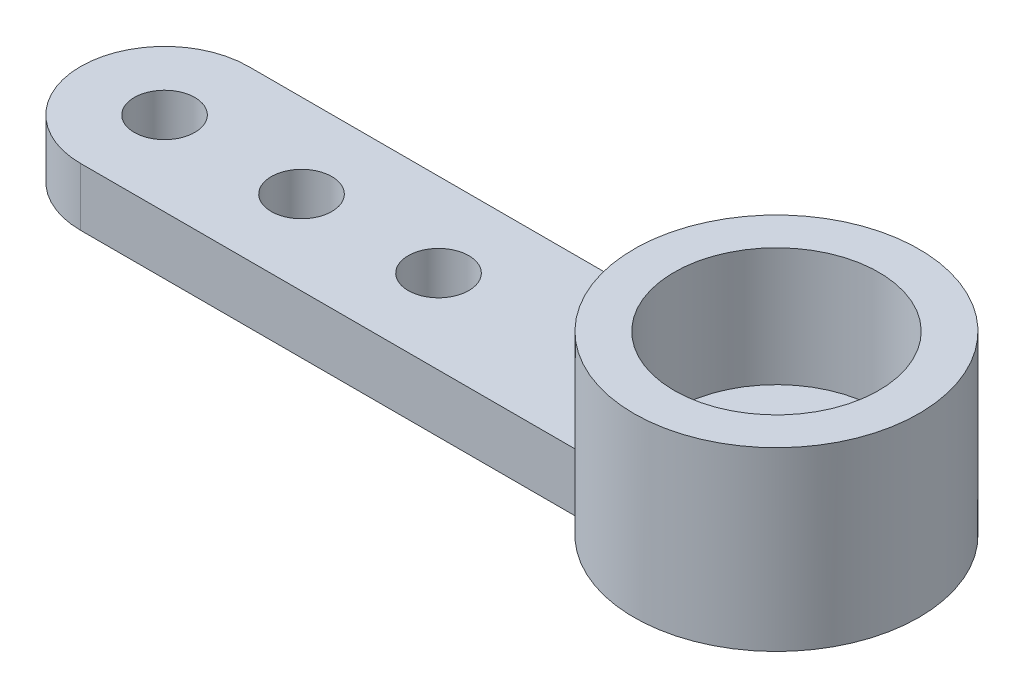
ISO-10303-21;
HEADER;
FILE_DESCRIPTION(('STEP AP214'),'2;1');
FILE_NAME('part.step','',(''),(''),'','','');
FILE_SCHEMA(('AUTOMOTIVE_DESIGN { 1 0 10303 214 1 1 1 1 }'));
ENDSEC;
DATA;
#1=APPLICATION_CONTEXT('core data for automotive mechanical design processes');
#2=APPLICATION_PROTOCOL_DEFINITION('international standard','automotive_design',2000,#1);
#3=PRODUCT_CONTEXT('',#1,'mechanical');
#4=PRODUCT('Part','Part','',(#3));
#5=PRODUCT_RELATED_PRODUCT_CATEGORY('part','',(#4));
#6=PRODUCT_DEFINITION_FORMATION('','',#4);
#7=PRODUCT_DEFINITION_CONTEXT('part definition',#1,'design');
#8=PRODUCT_DEFINITION('design','',#6,#7);
#9=PRODUCT_DEFINITION_SHAPE('','',#8);
#10=(LENGTH_UNIT() NAMED_UNIT(*) SI_UNIT(.MILLI.,.METRE.));
#11=(NAMED_UNIT(*) PLANE_ANGLE_UNIT() SI_UNIT($,.RADIAN.));
#12=(NAMED_UNIT(*) SI_UNIT($,.STERADIAN.) SOLID_ANGLE_UNIT());
#13=UNCERTAINTY_MEASURE_WITH_UNIT(LENGTH_MEASURE(1.E-05),#10,'distance_accuracy_value','');
#14=(GEOMETRIC_REPRESENTATION_CONTEXT(3) GLOBAL_UNCERTAINTY_ASSIGNED_CONTEXT((#13)) GLOBAL_UNIT_ASSIGNED_CONTEXT((#10,
#11,#12)) REPRESENTATION_CONTEXT('',''));
#15=CARTESIAN_POINT('',(0.,0.,0.));
#16=DIRECTION('',(0.,0.,1.));
#17=DIRECTION('',(1.,0.,0.));
#18=AXIS2_PLACEMENT_3D('',#15,#16,#17);
#19=CARTESIAN_POINT('',(0.,1.1,1.59385));
#20=DIRECTION('',(0.,0.,-1.));
#21=DIRECTION('',(-1.,0.,0.));
#22=AXIS2_PLACEMENT_3D('',#19,#20,#21);
#23=PLANE('',#22);
#24=DIRECTION('',(1.,0.,0.));
#25=VECTOR('',#24,1.);
#26=CARTESIAN_POINT('',(0.,0.,1.59385));
#27=LINE('',#26,#25);
#28=CARTESIAN_POINT('',(-11.61415,0.,1.59385));
#29=VERTEX_POINT('',#28);
#30=CARTESIAN_POINT('',(-2.18568254499596,0.,1.59385));
#31=VERTEX_POINT('',#30);
#32=EDGE_CURVE('E98',#29,#31,#27,.T.);
#33=ORIENTED_EDGE('',*,*,#32,.T.);
#34=DIRECTION('',(0.,-1.,0.));
#35=VECTOR('',#34,1.);
#36=CARTESIAN_POINT('',(-2.18568254499596,1.1,1.59385));
#37=LINE('',#36,#35);
#38=CARTESIAN_POINT('',(-2.18568254499596,1.1,1.59385));
#39=VERTEX_POINT('',#38);
#40=EDGE_CURVE('E11',#39,#31,#37,.T.);
#41=ORIENTED_EDGE('',*,*,#40,.F.);
#42=DIRECTION('',(1.,0.,0.));
#43=VECTOR('',#42,1.);
#44=CARTESIAN_POINT('',(0.,1.1,1.59385));
#45=LINE('',#44,#43);
#46=CARTESIAN_POINT('',(-11.61415,1.1,1.59385));
#47=VERTEX_POINT('',#46);
#48=EDGE_CURVE('E74',#47,#39,#45,.T.);
#49=ORIENTED_EDGE('',*,*,#48,.F.);
#50=DIRECTION('',(0.,-1.,0.));
#51=VECTOR('',#50,1.);
#52=CARTESIAN_POINT('',(-11.61415,1.1,1.59385));
#53=LINE('',#52,#51);
#54=EDGE_CURVE('E121',#47,#29,#53,.T.);
#55=ORIENTED_EDGE('',*,*,#54,.T.);
#56=EDGE_LOOP('',(#33,#41,#49,#55));
#57=FACE_BOUND('',#56,.T.);
#58=ADVANCED_FACE('F34',(#57),#23,.F.);
#59=CARTESIAN_POINT('',(0.,1.1,0.));
#60=DIRECTION('',(0.,-1.,0.));
#61=DIRECTION('',(0.,0.,-1.));
#62=AXIS2_PLACEMENT_3D('',#59,#60,#61);
#63=CYLINDRICAL_SURFACE('',#62,2.7051);
#64=CARTESIAN_POINT('',(0.,0.,0.));
#65=DIRECTION('',(0.,1.,0.));
#66=DIRECTION('',(0.,0.,1.));
#67=AXIS2_PLACEMENT_3D('',#64,#65,#66);
#68=CIRCLE('',#67,2.7051);
#69=CARTESIAN_POINT('',(-2.18568254499596,0.,-1.59385));
#70=VERTEX_POINT('',#69);
#71=EDGE_CURVE('E90',#31,#70,#68,.T.);
#72=ORIENTED_EDGE('',*,*,#71,.T.);
#73=DIRECTION('',(0.,-1.,0.));
#74=VECTOR('',#73,1.);
#75=CARTESIAN_POINT('',(-2.18568254499596,1.1,-1.59385));
#76=LINE('',#75,#74);
#77=CARTESIAN_POINT('',(-2.18568254499596,1.1,-1.59385));
#78=VERTEX_POINT('',#77);
#79=EDGE_CURVE('E43',#78,#70,#76,.T.);
#80=ORIENTED_EDGE('',*,*,#79,.F.);
#81=CARTESIAN_POINT('',(0.,1.1,0.));
#82=DIRECTION('',(0.,1.,0.));
#83=DIRECTION('',(0.,0.,1.));
#84=AXIS2_PLACEMENT_3D('',#81,#82,#83);
#85=CIRCLE('',#84,2.7051);
#86=EDGE_CURVE('E89',#78,#39,#85,.T.);
#87=ORIENTED_EDGE('',*,*,#86,.T.);
#88=ORIENTED_EDGE('',*,*,#40,.T.);
#89=EDGE_LOOP('',(#72,#80,#87,#88));
#90=FACE_BOUND('',#89,.T.);
#91=CARTESIAN_POINT('',(0.,3.35,0.));
#92=DIRECTION('',(0.,1.,0.));
#93=DIRECTION('',(0.,0.,1.));
#94=AXIS2_PLACEMENT_3D('',#91,#92,#93);
#95=CIRCLE('',#94,2.7051);
#96=CARTESIAN_POINT('',(0.,3.35,2.7051));
#97=VERTEX_POINT('',#96);
#98=EDGE_CURVE('E94',#97,#97,#95,.T.);
#99=ORIENTED_EDGE('',*,*,#98,.F.);
#100=EDGE_LOOP('',(#99));
#101=FACE_BOUND('',#100,.T.);
#102=ADVANCED_FACE('F87',(#90,#101),#63,.T.);
#103=CARTESIAN_POINT('',(0.,1.1,-1.59385));
#104=DIRECTION('',(0.,0.,-1.));
#105=DIRECTION('',(-1.,0.,0.));
#106=AXIS2_PLACEMENT_3D('',#103,#104,#105);
#107=PLANE('',#106);
#108=DIRECTION('',(1.,0.,0.));
#109=VECTOR('',#108,1.);
#110=CARTESIAN_POINT('',(0.,0.,-1.59385));
#111=LINE('',#110,#109);
#112=CARTESIAN_POINT('',(-11.61415,0.,-1.59385));
#113=VERTEX_POINT('',#112);
#114=EDGE_CURVE('E117',#113,#70,#111,.T.);
#115=ORIENTED_EDGE('',*,*,#114,.F.);
#116=DIRECTION('',(0.,-1.,0.));
#117=VECTOR('',#116,1.);
#118=CARTESIAN_POINT('',(-11.61415,1.1,-1.59385));
#119=LINE('',#118,#117);
#120=CARTESIAN_POINT('',(-11.61415,1.1,-1.59385));
#121=VERTEX_POINT('',#120);
#122=EDGE_CURVE('E68',#121,#113,#119,.T.);
#123=ORIENTED_EDGE('',*,*,#122,.F.);
#124=DIRECTION('',(1.,0.,0.));
#125=VECTOR('',#124,1.);
#126=CARTESIAN_POINT('',(0.,1.1,-1.59385));
#127=LINE('',#126,#125);
#128=EDGE_CURVE('E79',#121,#78,#127,.T.);
#129=ORIENTED_EDGE('',*,*,#128,.T.);
#130=ORIENTED_EDGE('',*,*,#79,.T.);
#131=EDGE_LOOP('',(#115,#123,#129,#130));
#132=FACE_BOUND('',#131,.T.);
#133=ADVANCED_FACE('F82',(#132),#107,.T.);
#134=CARTESIAN_POINT('',(-11.61415,1.1,0.));
#135=DIRECTION('',(0.,-1.,0.));
#136=DIRECTION('',(0.,0.,-1.));
#137=AXIS2_PLACEMENT_3D('',#134,#135,#136);
#138=CYLINDRICAL_SURFACE('',#137,1.59385);
#139=CARTESIAN_POINT('',(-11.61415,0.,0.));
#140=DIRECTION('',(0.,1.,0.));
#141=DIRECTION('',(0.,0.,1.));
#142=AXIS2_PLACEMENT_3D('',#139,#140,#141);
#143=CIRCLE('',#142,1.59385);
#144=EDGE_CURVE('E70',#113,#29,#143,.T.);
#145=ORIENTED_EDGE('',*,*,#144,.T.);
#146=ORIENTED_EDGE('',*,*,#54,.F.);
#147=CARTESIAN_POINT('',(-11.61415,1.1,0.));
#148=DIRECTION('',(0.,1.,0.));
#149=DIRECTION('',(0.,0.,1.));
#150=AXIS2_PLACEMENT_3D('',#147,#148,#149);
#151=CIRCLE('',#150,1.59385);
#152=EDGE_CURVE('E51',#121,#47,#151,.T.);
#153=ORIENTED_EDGE('',*,*,#152,.F.);
#154=ORIENTED_EDGE('',*,*,#122,.T.);
#155=EDGE_LOOP('',(#145,#146,#153,#154));
#156=FACE_BOUND('',#155,.T.);
#157=ADVANCED_FACE('F138',(#156),#138,.T.);
#158=CARTESIAN_POINT('',(0.,1.1,0.));
#159=DIRECTION('',(0.,1.,0.));
#160=DIRECTION('',(0.,0.,1.));
#161=AXIS2_PLACEMENT_3D('',#158,#159,#160);
#162=PLANE('',#161);
#163=CARTESIAN_POINT('',(-6.41415,1.1,0.));
#164=DIRECTION('',(0.,1.,0.));
#165=DIRECTION('',(0.,0.,1.));
#166=AXIS2_PLACEMENT_3D('',#163,#164,#165);
#167=CIRCLE('',#166,0.575);
#168=CARTESIAN_POINT('',(-6.41415,1.1,0.575));
#169=VERTEX_POINT('',#168);
#170=EDGE_CURVE('E247',#169,#169,#167,.T.);
#171=ORIENTED_EDGE('',*,*,#170,.F.);
#172=EDGE_LOOP('',(#171));
#173=FACE_BOUND('',#172,.T.);
#174=CARTESIAN_POINT('',(-9.01415,1.1,0.));
#175=DIRECTION('',(0.,1.,0.));
#176=DIRECTION('',(0.,0.,1.));
#177=AXIS2_PLACEMENT_3D('',#174,#175,#176);
#178=CIRCLE('',#177,0.575);
#179=CARTESIAN_POINT('',(-9.01415,1.1,0.575));
#180=VERTEX_POINT('',#179);
#181=EDGE_CURVE('E241',#180,#180,#178,.T.);
#182=ORIENTED_EDGE('',*,*,#181,.F.);
#183=EDGE_LOOP('',(#182));
#184=FACE_BOUND('',#183,.T.);
#185=CARTESIAN_POINT('',(-11.61415,1.1,0.));
#186=DIRECTION('',(0.,1.,0.));
#187=DIRECTION('',(0.,0.,1.));
#188=AXIS2_PLACEMENT_3D('',#185,#186,#187);
#189=CIRCLE('',#188,0.575);
#190=CARTESIAN_POINT('',(-11.61415,1.1,0.575));
#191=VERTEX_POINT('',#190);
#192=EDGE_CURVE('E235',#191,#191,#189,.T.);
#193=ORIENTED_EDGE('',*,*,#192,.F.);
#194=EDGE_LOOP('',(#193));
#195=FACE_BOUND('',#194,.T.);
#196=ORIENTED_EDGE('',*,*,#86,.F.);
#197=ORIENTED_EDGE('',*,*,#128,.F.);
#198=ORIENTED_EDGE('',*,*,#152,.T.);
#199=ORIENTED_EDGE('',*,*,#48,.T.);
#200=EDGE_LOOP('',(#196,#197,#198,#199));
#201=FACE_BOUND('',#200,.T.);
#202=ADVANCED_FACE('F93',(#173,#184,#195,#201),#162,.T.);
#203=CARTESIAN_POINT('',(0.,0.,0.));
#204=DIRECTION('',(0.,1.,0.));
#205=DIRECTION('',(0.,0.,1.));
#206=AXIS2_PLACEMENT_3D('',#203,#204,#205);
#207=PLANE('',#206);
#208=CARTESIAN_POINT('',(-6.41415,0.,0.));
#209=DIRECTION('',(0.,1.,0.));
#210=DIRECTION('',(0.,0.,1.));
#211=AXIS2_PLACEMENT_3D('',#208,#209,#210);
#212=CIRCLE('',#211,0.575);
#213=CARTESIAN_POINT('',(-6.41415,0.,0.575));
#214=VERTEX_POINT('',#213);
#215=EDGE_CURVE('E244',#214,#214,#212,.F.);
#216=ORIENTED_EDGE('',*,*,#215,.F.);
#217=EDGE_LOOP('',(#216));
#218=FACE_BOUND('',#217,.T.);
#219=CARTESIAN_POINT('',(-9.01415,0.,0.));
#220=DIRECTION('',(0.,1.,0.));
#221=DIRECTION('',(0.,0.,1.));
#222=AXIS2_PLACEMENT_3D('',#219,#220,#221);
#223=CIRCLE('',#222,0.575);
#224=CARTESIAN_POINT('',(-9.01415,0.,0.575));
#225=VERTEX_POINT('',#224);
#226=EDGE_CURVE('E238',#225,#225,#223,.F.);
#227=ORIENTED_EDGE('',*,*,#226,.F.);
#228=EDGE_LOOP('',(#227));
#229=FACE_BOUND('',#228,.T.);
#230=CARTESIAN_POINT('',(-11.61415,0.,0.));
#231=DIRECTION('',(0.,1.,0.));
#232=DIRECTION('',(0.,0.,1.));
#233=AXIS2_PLACEMENT_3D('',#230,#231,#232);
#234=CIRCLE('',#233,0.575);
#235=CARTESIAN_POINT('',(-11.61415,0.,0.575));
#236=VERTEX_POINT('',#235);
#237=EDGE_CURVE('E232',#236,#236,#234,.F.);
#238=ORIENTED_EDGE('',*,*,#237,.F.);
#239=EDGE_LOOP('',(#238));
#240=FACE_BOUND('',#239,.T.);
#241=CARTESIAN_POINT('',(0.,0.,0.));
#242=DIRECTION('',(0.,1.,0.));
#243=DIRECTION('',(0.,0.,1.));
#244=AXIS2_PLACEMENT_3D('',#241,#242,#243);
#245=CIRCLE('',#244,0.930000045);
#246=CARTESIAN_POINT('',(0.,0.,0.930000045));
#247=VERTEX_POINT('',#246);
#248=EDGE_CURVE('E225',#247,#247,#245,.T.);
#249=ORIENTED_EDGE('',*,*,#248,.T.);
#250=EDGE_LOOP('',(#249));
#251=FACE_BOUND('',#250,.T.);
#252=ORIENTED_EDGE('',*,*,#32,.F.);
#253=ORIENTED_EDGE('',*,*,#144,.F.);
#254=ORIENTED_EDGE('',*,*,#114,.T.);
#255=ORIENTED_EDGE('',*,*,#71,.F.);
#256=EDGE_LOOP('',(#252,#253,#254,#255));
#257=FACE_BOUND('',#256,.T.);
#258=ADVANCED_FACE('F126',(#218,#229,#240,#251,#257),#207,.F.);
#259=CARTESIAN_POINT('',(0.,3.35,0.));
#260=DIRECTION('',(0.,1.,0.));
#261=DIRECTION('',(0.,0.,1.));
#262=AXIS2_PLACEMENT_3D('',#259,#260,#261);
#263=PLANE('',#262);
#264=ORIENTED_EDGE('',*,*,#98,.T.);
#265=EDGE_LOOP('',(#264));
#266=FACE_BOUND('',#265,.T.);
#267=CARTESIAN_POINT('',(0.,3.35,0.));
#268=DIRECTION('',(0.,1.,0.));
#269=DIRECTION('',(0.,0.,1.));
#270=AXIS2_PLACEMENT_3D('',#267,#268,#269);
#271=CIRCLE('',#270,1.9431);
#272=CARTESIAN_POINT('',(0.,3.35,1.9431));
#273=VERTEX_POINT('',#272);
#274=EDGE_CURVE('E95',#273,#273,#271,.T.);
#275=ORIENTED_EDGE('',*,*,#274,.F.);
#276=EDGE_LOOP('',(#275));
#277=FACE_BOUND('',#276,.T.);
#278=ADVANCED_FACE('F128',(#266,#277),#263,.T.);
#279=CARTESIAN_POINT('',(0.,3.35,0.));
#280=DIRECTION('',(0.,-1.,0.));
#281=DIRECTION('',(0.,0.,-1.));
#282=AXIS2_PLACEMENT_3D('',#279,#280,#281);
#283=CYLINDRICAL_SURFACE('',#282,1.9431);
#284=ORIENTED_EDGE('',*,*,#274,.T.);
#285=EDGE_LOOP('',(#284));
#286=FACE_BOUND('',#285,.T.);
#287=CARTESIAN_POINT('',(0.,1.1,0.));
#288=DIRECTION('',(0.,1.,0.));
#289=DIRECTION('',(0.,0.,1.));
#290=AXIS2_PLACEMENT_3D('',#287,#288,#289);
#291=CIRCLE('',#290,1.9431);
#292=CARTESIAN_POINT('',(0.,1.1,1.9431));
#293=VERTEX_POINT('',#292);
#294=EDGE_CURVE('E101',#293,#293,#291,.T.);
#295=ORIENTED_EDGE('',*,*,#294,.F.);
#296=EDGE_LOOP('',(#295));
#297=FACE_BOUND('',#296,.T.);
#298=ADVANCED_FACE('F135',(#286,#297),#283,.F.);
#299=CARTESIAN_POINT('',(0.,1.1,0.));
#300=DIRECTION('',(0.,1.,0.));
#301=DIRECTION('',(0.,0.,1.));
#302=AXIS2_PLACEMENT_3D('',#299,#300,#301);
#303=CIRCLE('',#302,0.930000045);
#304=CARTESIAN_POINT('',(0.,1.1,0.930000045));
#305=VERTEX_POINT('',#304);
#306=EDGE_CURVE('E227',#305,#305,#303,.T.);
#307=ORIENTED_EDGE('',*,*,#306,.F.);
#308=EDGE_LOOP('',(#307));
#309=FACE_BOUND('',#308,.T.);
#310=ORIENTED_EDGE('',*,*,#294,.T.);
#311=EDGE_LOOP('',(#310));
#312=FACE_BOUND('',#311,.T.);
#313=ADVANCED_FACE('F141',(#309,#312),#162,.T.);
#314=CARTESIAN_POINT('',(0.,-2.50000000000684E-05,0.));
#315=DIRECTION('',(0.,1.,0.));
#316=DIRECTION('',(0.,0.,1.));
#317=AXIS2_PLACEMENT_3D('',#314,#315,#316);
#318=CYLINDRICAL_SURFACE('',#317,0.930000045);
#319=ORIENTED_EDGE('',*,*,#306,.T.);
#320=EDGE_LOOP('',(#319));
#321=FACE_BOUND('',#320,.T.);
#322=ORIENTED_EDGE('',*,*,#248,.F.);
#323=EDGE_LOOP('',(#322));
#324=FACE_BOUND('',#323,.T.);
#325=ADVANCED_FACE('F169',(#321,#324),#318,.F.);
#326=CARTESIAN_POINT('',(-11.61415,-0.00102499999999998,0.));
#327=DIRECTION('',(0.,1.,0.));
#328=DIRECTION('',(0.,0.,1.));
#329=AXIS2_PLACEMENT_3D('',#326,#327,#328);
#330=CYLINDRICAL_SURFACE('',#329,0.575);
#331=ORIENTED_EDGE('',*,*,#192,.T.);
#332=EDGE_LOOP('',(#331));
#333=FACE_BOUND('',#332,.T.);
#334=ORIENTED_EDGE('',*,*,#237,.T.);
#335=EDGE_LOOP('',(#334));
#336=FACE_BOUND('',#335,.T.);
#337=ADVANCED_FACE('F180',(#333,#336),#330,.F.);
#338=CARTESIAN_POINT('',(-9.01415,-0.00102499999999998,0.));
#339=DIRECTION('',(0.,1.,0.));
#340=DIRECTION('',(0.,0.,1.));
#341=AXIS2_PLACEMENT_3D('',#338,#339,#340);
#342=CYLINDRICAL_SURFACE('',#341,0.575);
#343=ORIENTED_EDGE('',*,*,#181,.T.);
#344=EDGE_LOOP('',(#343));
#345=FACE_BOUND('',#344,.T.);
#346=ORIENTED_EDGE('',*,*,#226,.T.);
#347=EDGE_LOOP('',(#346));
#348=FACE_BOUND('',#347,.T.);
#349=ADVANCED_FACE('F185',(#345,#348),#342,.F.);
#350=CARTESIAN_POINT('',(-6.41415,-0.00102499999999998,0.));
#351=DIRECTION('',(0.,1.,0.));
#352=DIRECTION('',(0.,0.,1.));
#353=AXIS2_PLACEMENT_3D('',#350,#351,#352);
#354=CYLINDRICAL_SURFACE('',#353,0.575);
#355=ORIENTED_EDGE('',*,*,#170,.T.);
#356=EDGE_LOOP('',(#355));
#357=FACE_BOUND('',#356,.T.);
#358=ORIENTED_EDGE('',*,*,#215,.T.);
#359=EDGE_LOOP('',(#358));
#360=FACE_BOUND('',#359,.T.);
#361=ADVANCED_FACE('F195',(#357,#360),#354,.F.);
#362=CLOSED_SHELL('',(#58,#102,#133,#157,#202,#258,#278,#298,#313,#325,#337,#349,#361));
#363=MANIFOLD_SOLID_BREP('B2',#362);
#364=ADVANCED_BREP_SHAPE_REPRESENTATION('',(#18,#363),#14);
#365=SHAPE_DEFINITION_REPRESENTATION(#9,#364);
ENDSEC;
END-ISO-10303-21;
